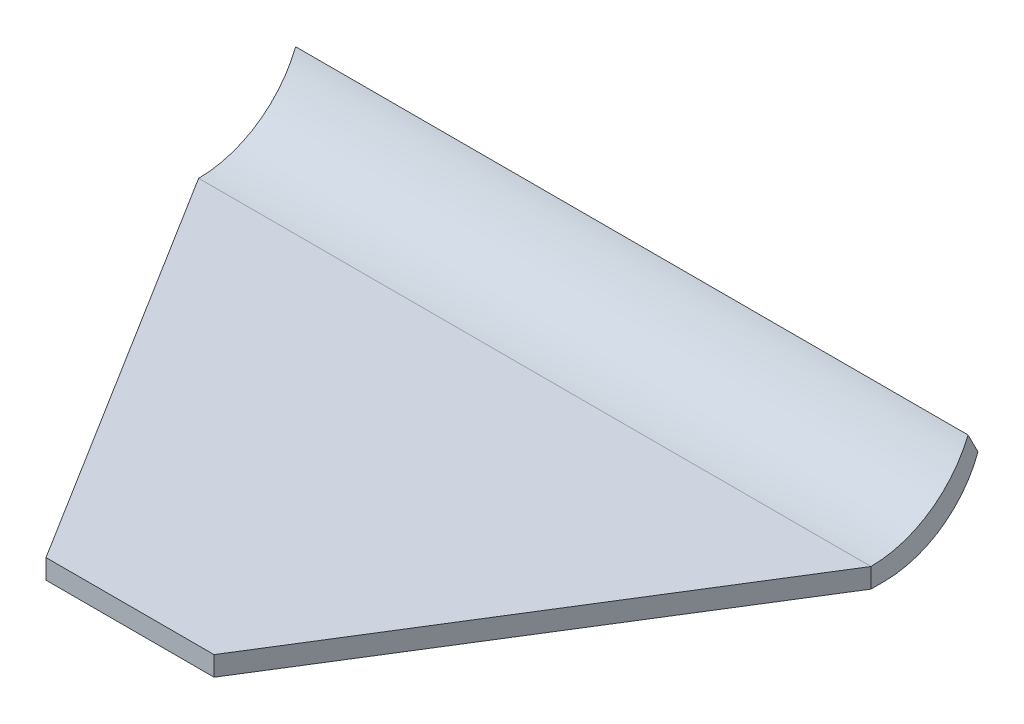
ISO-10303-21;
HEADER;
FILE_DESCRIPTION(('STEP AP214'),'2;1');
FILE_NAME('part.step','',(''),(''),'','','');
FILE_SCHEMA(('AUTOMOTIVE_DESIGN { 1 0 10303 214 1 1 1 1 }'));
ENDSEC;
DATA;
#1=APPLICATION_CONTEXT('core data for automotive mechanical design processes');
#2=APPLICATION_PROTOCOL_DEFINITION('international standard','automotive_design',2000,#1);
#3=PRODUCT_CONTEXT('',#1,'mechanical');
#4=PRODUCT('Part','Part','',(#3));
#5=PRODUCT_RELATED_PRODUCT_CATEGORY('part','',(#4));
#6=PRODUCT_DEFINITION_FORMATION('','',#4);
#7=PRODUCT_DEFINITION_CONTEXT('part definition',#1,'design');
#8=PRODUCT_DEFINITION('design','',#6,#7);
#9=PRODUCT_DEFINITION_SHAPE('','',#8);
#10=(LENGTH_UNIT() NAMED_UNIT(*) SI_UNIT(.MILLI.,.METRE.));
#11=(NAMED_UNIT(*) PLANE_ANGLE_UNIT() SI_UNIT($,.RADIAN.));
#12=(NAMED_UNIT(*) SI_UNIT($,.STERADIAN.) SOLID_ANGLE_UNIT());
#13=UNCERTAINTY_MEASURE_WITH_UNIT(LENGTH_MEASURE(1.E-05),#10,'distance_accuracy_value','');
#14=(GEOMETRIC_REPRESENTATION_CONTEXT(3) GLOBAL_UNCERTAINTY_ASSIGNED_CONTEXT((#13)) GLOBAL_UNIT_ASSIGNED_CONTEXT((#10,
#11,#12)) REPRESENTATION_CONTEXT('',''));
#15=CARTESIAN_POINT('',(0.,0.,0.));
#16=DIRECTION('',(0.,0.,1.));
#17=DIRECTION('',(1.,0.,0.));
#18=AXIS2_PLACEMENT_3D('',#15,#16,#17);
#19=CARTESIAN_POINT('',(1200.,61.507962158724,167.287455412937));
#20=DIRECTION('',(-1.,0.,0.));
#21=DIRECTION('',(0.,0.,1.));
#22=AXIS2_PLACEMENT_3D('',#19,#20,#21);
#23=CYLINDRICAL_SURFACE('',#22,178.236702582422);
#24=CARTESIAN_POINT('',(0.,61.507962158724,167.287455412937));
#25=DIRECTION('',(1.,0.,0.));
#26=DIRECTION('',(0.,0.,-1.));
#27=AXIS2_PLACEMENT_3D('',#24,#25,#26);
#28=CIRCLE('',#27,178.236702582422);
#29=CARTESIAN_POINT('',(0.,0.,0.));
#30=VERTEX_POINT('',#29);
#31=CARTESIAN_POINT('',(0.,-116.728740423698,167.287455412936));
#32=VERTEX_POINT('',#31);
#33=EDGE_CURVE('E140',#30,#32,#28,.F.);
#34=ORIENTED_EDGE('',*,*,#33,.F.);
#35=DIRECTION('',(-1.,0.,0.));
#36=VECTOR('',#35,1.);
#37=CARTESIAN_POINT('',(1200.,0.,0.));
#38=LINE('',#37,#36);
#39=CARTESIAN_POINT('',(1200.,0.,0.));
#40=VERTEX_POINT('',#39);
#41=EDGE_CURVE('E78',#40,#30,#38,.T.);
#42=ORIENTED_EDGE('',*,*,#41,.F.);
#43=CARTESIAN_POINT('',(1200.,61.507962158724,167.287455412937));
#44=DIRECTION('',(1.,0.,0.));
#45=DIRECTION('',(0.,0.,-1.));
#46=AXIS2_PLACEMENT_3D('',#43,#44,#45);
#47=CIRCLE('',#46,178.236702582422);
#48=CARTESIAN_POINT('',(1200.,-116.728740423698,167.287455412936));
#49=VERTEX_POINT('',#48);
#50=EDGE_CURVE('E145',#40,#49,#47,.F.);
#51=ORIENTED_EDGE('',*,*,#50,.T.);
#52=DIRECTION('',(-1.,0.,0.));
#53=VECTOR('',#52,1.);
#54=CARTESIAN_POINT('',(1200.,-116.728740423698,167.287455412936));
#55=LINE('',#54,#53);
#56=EDGE_CURVE('E57',#49,#32,#55,.T.);
#57=ORIENTED_EDGE('',*,*,#56,.T.);
#58=EDGE_LOOP('',(#34,#42,#51,#57));
#59=FACE_BOUND('',#58,.T.);
#60=ADVANCED_FACE('F35',(#59),#23,.T.);
#61=CARTESIAN_POINT('',(1200.,0.,0.));
#62=DIRECTION('',(0.,-0.453315269503567,0.891350249023867));
#63=DIRECTION('',(0.,-0.891350249023867,-0.453315269503567));
#64=AXIS2_PLACEMENT_3D('',#61,#62,#63);
#65=PLANE('',#64);
#66=DIRECTION('',(0.,0.891350249023867,0.453315269503567));
#67=VECTOR('',#66,1.);
#68=CARTESIAN_POINT('',(0.,0.,0.));
#69=LINE('',#68,#67);
#70=CARTESIAN_POINT('',(0.,35.,17.8));
#71=VERTEX_POINT('',#70);
#72=EDGE_CURVE('E155',#30,#71,#69,.T.);
#73=ORIENTED_EDGE('',*,*,#72,.T.);
#74=DIRECTION('',(-1.,0.,0.));
#75=VECTOR('',#74,1.);
#76=CARTESIAN_POINT('',(1200.,35.,17.8));
#77=LINE('',#76,#75);
#78=CARTESIAN_POINT('',(1200.,35.,17.8));
#79=VERTEX_POINT('',#78);
#80=EDGE_CURVE('E124',#79,#71,#77,.T.);
#81=ORIENTED_EDGE('',*,*,#80,.F.);
#82=DIRECTION('',(0.,0.891350249023867,0.453315269503567));
#83=VECTOR('',#82,1.);
#84=CARTESIAN_POINT('',(1200.,0.,0.));
#85=LINE('',#84,#83);
#86=EDGE_CURVE('E147',#40,#79,#85,.T.);
#87=ORIENTED_EDGE('',*,*,#86,.F.);
#88=ORIENTED_EDGE('',*,*,#41,.T.);
#89=EDGE_LOOP('',(#73,#81,#87,#88));
#90=FACE_BOUND('',#89,.T.);
#91=ADVANCED_FACE('F163',(#90),#65,.F.);
#92=CARTESIAN_POINT('',(1200.,105.154274044026,191.015585124142));
#93=DIRECTION('',(-1.,0.,0.));
#94=DIRECTION('',(0.,0.,1.));
#95=AXIS2_PLACEMENT_3D('',#92,#93,#94);
#96=CYLINDRICAL_SURFACE('',#95,186.883014467723);
#97=CARTESIAN_POINT('',(0.,105.154274044026,191.015585124142));
#98=DIRECTION('',(1.,0.,0.));
#99=DIRECTION('',(0.,0.,-1.));
#100=AXIS2_PLACEMENT_3D('',#97,#98,#99);
#101=CIRCLE('',#100,186.883014467723);
#102=CARTESIAN_POINT('',(0.,-81.7287404236974,191.015585124142));
#103=VERTEX_POINT('',#102);
#104=EDGE_CURVE('E136',#71,#103,#101,.F.);
#105=ORIENTED_EDGE('',*,*,#104,.T.);
#106=DIRECTION('',(-1.,0.,0.));
#107=VECTOR('',#106,1.);
#108=CARTESIAN_POINT('',(1200.,-81.7287404236974,191.015585124142));
#109=LINE('',#108,#107);
#110=CARTESIAN_POINT('',(1200.,-81.7287404236974,191.015585124142));
#111=VERTEX_POINT('',#110);
#112=EDGE_CURVE('E116',#111,#103,#109,.T.);
#113=ORIENTED_EDGE('',*,*,#112,.F.);
#114=CARTESIAN_POINT('',(1200.,105.154274044026,191.015585124142));
#115=DIRECTION('',(1.,0.,0.));
#116=DIRECTION('',(0.,0.,-1.));
#117=AXIS2_PLACEMENT_3D('',#114,#115,#116);
#118=CIRCLE('',#117,186.883014467723);
#119=EDGE_CURVE('E149',#79,#111,#118,.F.);
#120=ORIENTED_EDGE('',*,*,#119,.F.);
#121=ORIENTED_EDGE('',*,*,#80,.T.);
#122=EDGE_LOOP('',(#105,#113,#120,#121));
#123=FACE_BOUND('',#122,.T.);
#124=ADVANCED_FACE('F159',(#123),#96,.F.);
#125=CARTESIAN_POINT('',(1200.,-81.7287404236974,0.));
#126=DIRECTION('',(0.,1.,0.));
#127=DIRECTION('',(0.,0.,1.));
#128=AXIS2_PLACEMENT_3D('',#125,#126,#127);
#129=PLANE('',#128);
#130=DIRECTION('',(-0.528709982360412,0.,-0.848802541556311));
#131=VECTOR('',#130,1.);
#132=CARTESIAN_POINT('',(-85.722136105812,-81.7287404236974,53.3953974563988));
#133=LINE('',#132,#131);
#134=CARTESIAN_POINT('',(450.,-81.7287404236974,913.455403633119));
#135=VERTEX_POINT('',#134);
#136=EDGE_CURVE('E100',#135,#103,#133,.T.);
#137=ORIENTED_EDGE('',*,*,#136,.F.);
#138=DIRECTION('',(-1.,0.,0.));
#139=VECTOR('',#138,1.);
#140=CARTESIAN_POINT('',(1200.,-81.7287404236974,913.455403633119));
#141=LINE('',#140,#139);
#142=CARTESIAN_POINT('',(750.,-81.7287404236974,913.455403633119));
#143=VERTEX_POINT('',#142);
#144=EDGE_CURVE('E114',#143,#135,#141,.T.);
#145=ORIENTED_EDGE('',*,*,#144,.F.);
#146=DIRECTION('',(-0.528709982360412,0.,0.848802541556311));
#147=VECTOR('',#146,1.);
#148=CARTESIAN_POINT('',(950.281041568756,-81.7287404236974,591.919849584851));
#149=LINE('',#148,#147);
#150=EDGE_CURVE('E253',#111,#143,#149,.T.);
#151=ORIENTED_EDGE('',*,*,#150,.F.);
#152=ORIENTED_EDGE('',*,*,#112,.T.);
#153=EDGE_LOOP('',(#137,#145,#151,#152));
#154=FACE_BOUND('',#153,.T.);
#155=ADVANCED_FACE('F112',(#154),#129,.T.);
#156=CARTESIAN_POINT('',(1200.,0.,913.455403633119));
#157=DIRECTION('',(0.,0.,1.));
#158=DIRECTION('',(1.,0.,0.));
#159=AXIS2_PLACEMENT_3D('',#156,#157,#158);
#160=PLANE('',#159);
#161=DIRECTION('',(0.,1.,0.));
#162=VECTOR('',#161,1.);
#163=CARTESIAN_POINT('',(450.,-1281.7287404237,913.455403633119));
#164=LINE('',#163,#162);
#165=CARTESIAN_POINT('',(450.,-116.728740423699,913.455403633119));
#166=VERTEX_POINT('',#165);
#167=EDGE_CURVE('E97',#166,#135,#164,.T.);
#168=ORIENTED_EDGE('',*,*,#167,.F.);
#169=DIRECTION('',(-1.,0.,0.));
#170=VECTOR('',#169,1.);
#171=CARTESIAN_POINT('',(1200.,-116.728740423697,913.455403633119));
#172=LINE('',#171,#170);
#173=CARTESIAN_POINT('',(750.,-116.728740423699,913.455403633119));
#174=VERTEX_POINT('',#173);
#175=EDGE_CURVE('E122',#174,#166,#172,.T.);
#176=ORIENTED_EDGE('',*,*,#175,.F.);
#177=DIRECTION('',(0.,1.,0.));
#178=VECTOR('',#177,1.);
#179=CARTESIAN_POINT('',(750.,-1281.7287404237,913.455403633119));
#180=LINE('',#179,#178);
#181=EDGE_CURVE('E118',#174,#143,#180,.T.);
#182=ORIENTED_EDGE('',*,*,#181,.T.);
#183=ORIENTED_EDGE('',*,*,#144,.T.);
#184=EDGE_LOOP('',(#168,#176,#182,#183));
#185=FACE_BOUND('',#184,.T.);
#186=ADVANCED_FACE('F121',(#185),#160,.T.);
#187=CARTESIAN_POINT('',(1200.,-116.728740423701,4.93793666157387E-13));
#188=DIRECTION('',(0.,-1.,0.));
#189=DIRECTION('',(0.,0.,-1.));
#190=AXIS2_PLACEMENT_3D('',#187,#188,#189);
#191=PLANE('',#190);
#192=DIRECTION('',(0.528709982360412,0.,0.848802541556311));
#193=VECTOR('',#192,1.);
#194=CARTESIAN_POINT('',(249.718958431244,-116.728740423699,591.919849584851));
#195=LINE('',#194,#193);
#196=CARTESIAN_POINT('',(0.,-116.7287404237,191.015585124142));
#197=VERTEX_POINT('',#196);
#198=EDGE_CURVE('E103',#197,#166,#195,.T.);
#199=ORIENTED_EDGE('',*,*,#198,.F.);
#200=DIRECTION('',(0.,0.,1.));
#201=VECTOR('',#200,1.);
#202=CARTESIAN_POINT('',(0.,-116.728740423701,4.93793666157387E-13));
#203=LINE('',#202,#201);
#204=EDGE_CURVE('E137',#32,#197,#203,.T.);
#205=ORIENTED_EDGE('',*,*,#204,.F.);
#206=ORIENTED_EDGE('',*,*,#56,.F.);
#207=DIRECTION('',(0.,0.,1.));
#208=VECTOR('',#207,1.);
#209=CARTESIAN_POINT('',(1200.,-116.728740423701,4.93793666157387E-13));
#210=LINE('',#209,#208);
#211=CARTESIAN_POINT('',(1200.,-116.728740423701,191.015585124142));
#212=VERTEX_POINT('',#211);
#213=EDGE_CURVE('E152',#49,#212,#210,.T.);
#214=ORIENTED_EDGE('',*,*,#213,.T.);
#215=DIRECTION('',(0.528709982360412,0.,-0.848802541556311));
#216=VECTOR('',#215,1.);
#217=CARTESIAN_POINT('',(1285.72213610581,-116.728740423701,53.3953974563991));
#218=LINE('',#217,#216);
#219=EDGE_CURVE('E48',#174,#212,#218,.T.);
#220=ORIENTED_EDGE('',*,*,#219,.F.);
#221=ORIENTED_EDGE('',*,*,#175,.T.);
#222=EDGE_LOOP('',(#199,#205,#206,#214,#220,#221));
#223=FACE_BOUND('',#222,.T.);
#224=ADVANCED_FACE('F138',(#223),#191,.T.);
#225=CARTESIAN_POINT('',(1200.,0.,0.));
#226=DIRECTION('',(1.,0.,0.));
#227=DIRECTION('',(0.,0.,-1.));
#228=AXIS2_PLACEMENT_3D('',#225,#226,#227);
#229=PLANE('',#228);
#230=DIRECTION('',(0.,1.,0.));
#231=VECTOR('',#230,1.);
#232=CARTESIAN_POINT('',(1200.,0.,191.015585124142));
#233=LINE('',#232,#231);
#234=EDGE_CURVE('E11',#212,#111,#233,.T.);
#235=ORIENTED_EDGE('',*,*,#234,.F.);
#236=ORIENTED_EDGE('',*,*,#213,.F.);
#237=ORIENTED_EDGE('',*,*,#50,.F.);
#238=ORIENTED_EDGE('',*,*,#86,.T.);
#239=ORIENTED_EDGE('',*,*,#119,.T.);
#240=EDGE_LOOP('',(#235,#236,#237,#238,#239));
#241=FACE_BOUND('',#240,.T.);
#242=ADVANCED_FACE('F180',(#241),#229,.T.);
#243=CARTESIAN_POINT('',(0.,0.,0.));
#244=DIRECTION('',(1.,0.,0.));
#245=DIRECTION('',(0.,0.,-1.));
#246=AXIS2_PLACEMENT_3D('',#243,#244,#245);
#247=PLANE('',#246);
#248=ORIENTED_EDGE('',*,*,#204,.T.);
#249=DIRECTION('',(0.,1.,0.));
#250=VECTOR('',#249,1.);
#251=CARTESIAN_POINT('',(0.,0.,191.015585124142));
#252=LINE('',#251,#250);
#253=EDGE_CURVE('E42',#197,#103,#252,.T.);
#254=ORIENTED_EDGE('',*,*,#253,.T.);
#255=ORIENTED_EDGE('',*,*,#104,.F.);
#256=ORIENTED_EDGE('',*,*,#72,.F.);
#257=ORIENTED_EDGE('',*,*,#33,.T.);
#258=EDGE_LOOP('',(#248,#254,#255,#256,#257));
#259=FACE_BOUND('',#258,.T.);
#260=ADVANCED_FACE('F134',(#259),#247,.F.);
#261=CARTESIAN_POINT('',(-85.722136105812,-1281.7287404237,53.3953974563988));
#262=DIRECTION('',(0.848802541556311,0.,-0.528709982360412));
#263=DIRECTION('',(-0.528709982360412,0.,-0.848802541556311));
#264=AXIS2_PLACEMENT_3D('',#261,#262,#263);
#265=PLANE('',#264);
#266=ORIENTED_EDGE('',*,*,#198,.T.);
#267=ORIENTED_EDGE('',*,*,#167,.T.);
#268=ORIENTED_EDGE('',*,*,#136,.T.);
#269=ORIENTED_EDGE('',*,*,#253,.F.);
#270=EDGE_LOOP('',(#266,#267,#268,#269));
#271=FACE_BOUND('',#270,.T.);
#272=ADVANCED_FACE('F99',(#271),#265,.F.);
#273=CARTESIAN_POINT('',(950.281041568756,-1281.7287404237,591.919849584851));
#274=DIRECTION('',(-0.848802541556311,0.,-0.528709982360412));
#275=DIRECTION('',(-0.528709982360412,0.,0.848802541556311));
#276=AXIS2_PLACEMENT_3D('',#273,#274,#275);
#277=PLANE('',#276);
#278=ORIENTED_EDGE('',*,*,#219,.T.);
#279=ORIENTED_EDGE('',*,*,#234,.T.);
#280=ORIENTED_EDGE('',*,*,#150,.T.);
#281=ORIENTED_EDGE('',*,*,#181,.F.);
#282=EDGE_LOOP('',(#278,#279,#280,#281));
#283=FACE_BOUND('',#282,.T.);
#284=ADVANCED_FACE('F186',(#283),#277,.F.);
#285=CLOSED_SHELL('',(#60,#91,#124,#155,#186,#224,#242,#260,#272,#284));
#286=MANIFOLD_SOLID_BREP('B2',#285);
#287=ADVANCED_BREP_SHAPE_REPRESENTATION('',(#18,#286),#14);
#288=SHAPE_DEFINITION_REPRESENTATION(#9,#287);
ENDSEC;
END-ISO-10303-21;
